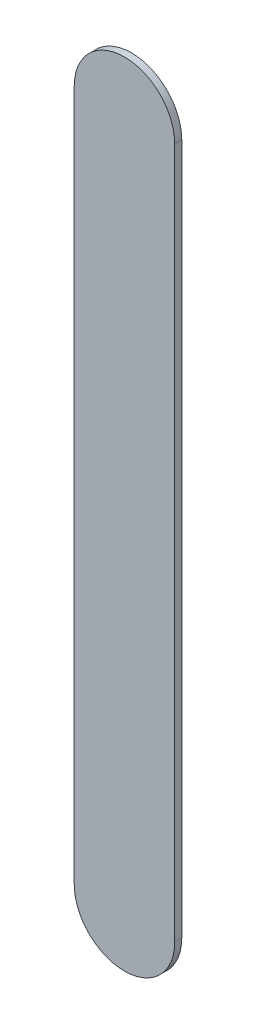
ISO-10303-21;
HEADER;
FILE_DESCRIPTION(('STEP AP214'),'2;1');
FILE_NAME('part.step','',(''),(''),'','','');
FILE_SCHEMA(('AUTOMOTIVE_DESIGN { 1 0 10303 214 1 1 1 1 }'));
ENDSEC;
DATA;
#1=APPLICATION_CONTEXT('core data for automotive mechanical design processes');
#2=APPLICATION_PROTOCOL_DEFINITION('international standard','automotive_design',2000,#1);
#3=PRODUCT_CONTEXT('',#1,'mechanical');
#4=PRODUCT('Part','Part','',(#3));
#5=PRODUCT_RELATED_PRODUCT_CATEGORY('part','',(#4));
#6=PRODUCT_DEFINITION_FORMATION('','',#4);
#7=PRODUCT_DEFINITION_CONTEXT('part definition',#1,'design');
#8=PRODUCT_DEFINITION('design','',#6,#7);
#9=PRODUCT_DEFINITION_SHAPE('','',#8);
#10=(LENGTH_UNIT() NAMED_UNIT(*) SI_UNIT(.MILLI.,.METRE.));
#11=(NAMED_UNIT(*) PLANE_ANGLE_UNIT() SI_UNIT($,.RADIAN.));
#12=(NAMED_UNIT(*) SI_UNIT($,.STERADIAN.) SOLID_ANGLE_UNIT());
#13=UNCERTAINTY_MEASURE_WITH_UNIT(LENGTH_MEASURE(1.E-05),#10,'distance_accuracy_value','');
#14=(GEOMETRIC_REPRESENTATION_CONTEXT(3) GLOBAL_UNCERTAINTY_ASSIGNED_CONTEXT((#13)) GLOBAL_UNIT_ASSIGNED_CONTEXT((#10,
#11,#12)) REPRESENTATION_CONTEXT('',''));
#15=CARTESIAN_POINT('',(0.,0.,0.));
#16=DIRECTION('',(0.,0.,1.));
#17=DIRECTION('',(1.,0.,0.));
#18=AXIS2_PLACEMENT_3D('',#15,#16,#17);
#19=CARTESIAN_POINT('',(96.93,-106.870001,1.635));
#20=DIRECTION('',(0.,0.,1.));
#21=DIRECTION('',(1.,0.,0.));
#22=AXIS2_PLACEMENT_3D('',#19,#20,#21);
#23=PLANE('',#22);
#24=DIRECTION('',(0.,1.,0.));
#25=VECTOR('',#24,1.);
#26=CARTESIAN_POINT('',(96.93,-106.870001,1.635));
#27=LINE('',#26,#25);
#28=CARTESIAN_POINT('',(96.93,-106.870001,1.635));
#29=VERTEX_POINT('',#28);
#30=CARTESIAN_POINT('',(96.93,-103.430001,1.635));
#31=VERTEX_POINT('',#30);
#32=EDGE_CURVE('E82',#29,#31,#27,.T.);
#33=ORIENTED_EDGE('',*,*,#32,.T.);
#34=CARTESIAN_POINT('',(96.68,-103.430001,1.635));
#35=DIRECTION('',(0.,0.,1.));
#36=DIRECTION('',(1.,0.,0.));
#37=AXIS2_PLACEMENT_3D('',#34,#35,#36);
#38=CIRCLE('',#37,0.25);
#39=CARTESIAN_POINT('',(96.43,-103.430001,1.635));
#40=VERTEX_POINT('',#39);
#41=EDGE_CURVE('E101',#31,#40,#38,.T.);
#42=ORIENTED_EDGE('',*,*,#41,.T.);
#43=DIRECTION('',(0.,-1.,0.));
#44=VECTOR('',#43,1.);
#45=CARTESIAN_POINT('',(96.43,-103.430001,1.635));
#46=LINE('',#45,#44);
#47=CARTESIAN_POINT('',(96.43,-106.870001,1.635));
#48=VERTEX_POINT('',#47);
#49=EDGE_CURVE('E75',#40,#48,#46,.T.);
#50=ORIENTED_EDGE('',*,*,#49,.T.);
#51=CARTESIAN_POINT('',(96.68,-106.870001,1.635));
#52=DIRECTION('',(0.,0.,1.));
#53=DIRECTION('',(-1.,0.,0.));
#54=AXIS2_PLACEMENT_3D('',#51,#52,#53);
#55=CIRCLE('',#54,0.25);
#56=EDGE_CURVE('E11',#48,#29,#55,.T.);
#57=ORIENTED_EDGE('',*,*,#56,.T.);
#58=EDGE_LOOP('',(#33,#42,#50,#57));
#59=FACE_BOUND('',#58,.T.);
#60=ADVANCED_FACE('F17',(#59),#23,.T.);
#61=CARTESIAN_POINT('',(96.93,-106.870001,1.6));
#62=DIRECTION('',(0.,0.,1.));
#63=DIRECTION('',(1.,0.,0.));
#64=AXIS2_PLACEMENT_3D('',#61,#62,#63);
#65=PLANE('',#64);
#66=CARTESIAN_POINT('',(96.68,-106.870001,1.6));
#67=DIRECTION('',(0.,0.,1.));
#68=DIRECTION('',(-1.,0.,0.));
#69=AXIS2_PLACEMENT_3D('',#66,#67,#68);
#70=CIRCLE('',#69,0.25);
#71=CARTESIAN_POINT('',(96.43,-106.870001,1.6));
#72=VERTEX_POINT('',#71);
#73=CARTESIAN_POINT('',(96.93,-106.870001,1.6));
#74=VERTEX_POINT('',#73);
#75=EDGE_CURVE('E26',#72,#74,#70,.T.);
#76=ORIENTED_EDGE('',*,*,#75,.F.);
#77=DIRECTION('',(0.,-1.,0.));
#78=VECTOR('',#77,1.);
#79=CARTESIAN_POINT('',(96.43,-103.430001,1.6));
#80=LINE('',#79,#78);
#81=CARTESIAN_POINT('',(96.43,-103.430001,1.6));
#82=VERTEX_POINT('',#81);
#83=EDGE_CURVE('E98',#82,#72,#80,.T.);
#84=ORIENTED_EDGE('',*,*,#83,.F.);
#85=CARTESIAN_POINT('',(96.68,-103.430001,1.6));
#86=DIRECTION('',(0.,0.,1.));
#87=DIRECTION('',(1.,0.,0.));
#88=AXIS2_PLACEMENT_3D('',#85,#86,#87);
#89=CIRCLE('',#88,0.25);
#90=CARTESIAN_POINT('',(96.93,-103.430001,1.6));
#91=VERTEX_POINT('',#90);
#92=EDGE_CURVE('E84',#91,#82,#89,.T.);
#93=ORIENTED_EDGE('',*,*,#92,.F.);
#94=DIRECTION('',(0.,1.,0.));
#95=VECTOR('',#94,1.);
#96=CARTESIAN_POINT('',(96.93,-106.870001,1.6));
#97=LINE('',#96,#95);
#98=EDGE_CURVE('E80',#74,#91,#97,.T.);
#99=ORIENTED_EDGE('',*,*,#98,.F.);
#100=EDGE_LOOP('',(#76,#84,#93,#99));
#101=FACE_BOUND('',#100,.T.);
#102=ADVANCED_FACE('F19',(#101),#65,.F.);
#103=CARTESIAN_POINT('',(96.68,-106.870001,1.6));
#104=DIRECTION('',(0.,0.,-1.));
#105=DIRECTION('',(-1.,0.,0.));
#106=AXIS2_PLACEMENT_3D('',#103,#104,#105);
#107=CYLINDRICAL_SURFACE('',#106,0.25);
#108=ORIENTED_EDGE('',*,*,#75,.T.);
#109=DIRECTION('',(0.,0.,1.));
#110=VECTOR('',#109,1.);
#111=CARTESIAN_POINT('',(96.93,-106.870001,1.6));
#112=LINE('',#111,#110);
#113=EDGE_CURVE('E69',#74,#29,#112,.T.);
#114=ORIENTED_EDGE('',*,*,#113,.T.);
#115=ORIENTED_EDGE('',*,*,#56,.F.);
#116=DIRECTION('',(0.,0.,1.));
#117=VECTOR('',#116,1.);
#118=CARTESIAN_POINT('',(96.43,-106.870001,1.6));
#119=LINE('',#118,#117);
#120=EDGE_CURVE('E72',#72,#48,#119,.T.);
#121=ORIENTED_EDGE('',*,*,#120,.F.);
#122=EDGE_LOOP('',(#108,#114,#115,#121));
#123=FACE_BOUND('',#122,.T.);
#124=ADVANCED_FACE('F68',(#123),#107,.T.);
#125=CARTESIAN_POINT('',(96.43,-103.430001,1.6));
#126=DIRECTION('',(1.,0.,0.));
#127=DIRECTION('',(0.,1.,0.));
#128=AXIS2_PLACEMENT_3D('',#125,#126,#127);
#129=PLANE('',#128);
#130=ORIENTED_EDGE('',*,*,#83,.T.);
#131=ORIENTED_EDGE('',*,*,#120,.T.);
#132=ORIENTED_EDGE('',*,*,#49,.F.);
#133=DIRECTION('',(0.,0.,1.));
#134=VECTOR('',#133,1.);
#135=CARTESIAN_POINT('',(96.43,-103.430001,1.6));
#136=LINE('',#135,#134);
#137=EDGE_CURVE('E107',#82,#40,#136,.T.);
#138=ORIENTED_EDGE('',*,*,#137,.F.);
#139=EDGE_LOOP('',(#130,#131,#132,#138));
#140=FACE_BOUND('',#139,.T.);
#141=ADVANCED_FACE('F119',(#140),#129,.F.);
#142=CARTESIAN_POINT('',(96.68,-103.430001,1.6));
#143=DIRECTION('',(0.,0.,-1.));
#144=DIRECTION('',(1.,0.,0.));
#145=AXIS2_PLACEMENT_3D('',#142,#143,#144);
#146=CYLINDRICAL_SURFACE('',#145,0.25);
#147=ORIENTED_EDGE('',*,*,#92,.T.);
#148=ORIENTED_EDGE('',*,*,#137,.T.);
#149=ORIENTED_EDGE('',*,*,#41,.F.);
#150=DIRECTION('',(0.,0.,1.));
#151=VECTOR('',#150,1.);
#152=CARTESIAN_POINT('',(96.93,-103.430001,1.6));
#153=LINE('',#152,#151);
#154=EDGE_CURVE('E89',#91,#31,#153,.T.);
#155=ORIENTED_EDGE('',*,*,#154,.F.);
#156=EDGE_LOOP('',(#147,#148,#149,#155));
#157=FACE_BOUND('',#156,.T.);
#158=ADVANCED_FACE('F121',(#157),#146,.T.);
#159=CARTESIAN_POINT('',(96.93,-106.870001,1.6));
#160=DIRECTION('',(-1.,0.,0.));
#161=DIRECTION('',(0.,0.,1.));
#162=AXIS2_PLACEMENT_3D('',#159,#160,#161);
#163=PLANE('',#162);
#164=ORIENTED_EDGE('',*,*,#98,.T.);
#165=ORIENTED_EDGE('',*,*,#154,.T.);
#166=ORIENTED_EDGE('',*,*,#32,.F.);
#167=ORIENTED_EDGE('',*,*,#113,.F.);
#168=EDGE_LOOP('',(#164,#165,#166,#167));
#169=FACE_BOUND('',#168,.T.);
#170=ADVANCED_FACE('F78',(#169),#163,.F.);
#171=CLOSED_SHELL('',(#60,#102,#124,#141,#158,#170));
#172=MANIFOLD_SOLID_BREP('B1',#171);
#173=ADVANCED_BREP_SHAPE_REPRESENTATION('',(#18,#172),#14);
#174=SHAPE_DEFINITION_REPRESENTATION(#9,#173);
ENDSEC;
END-ISO-10303-21;
